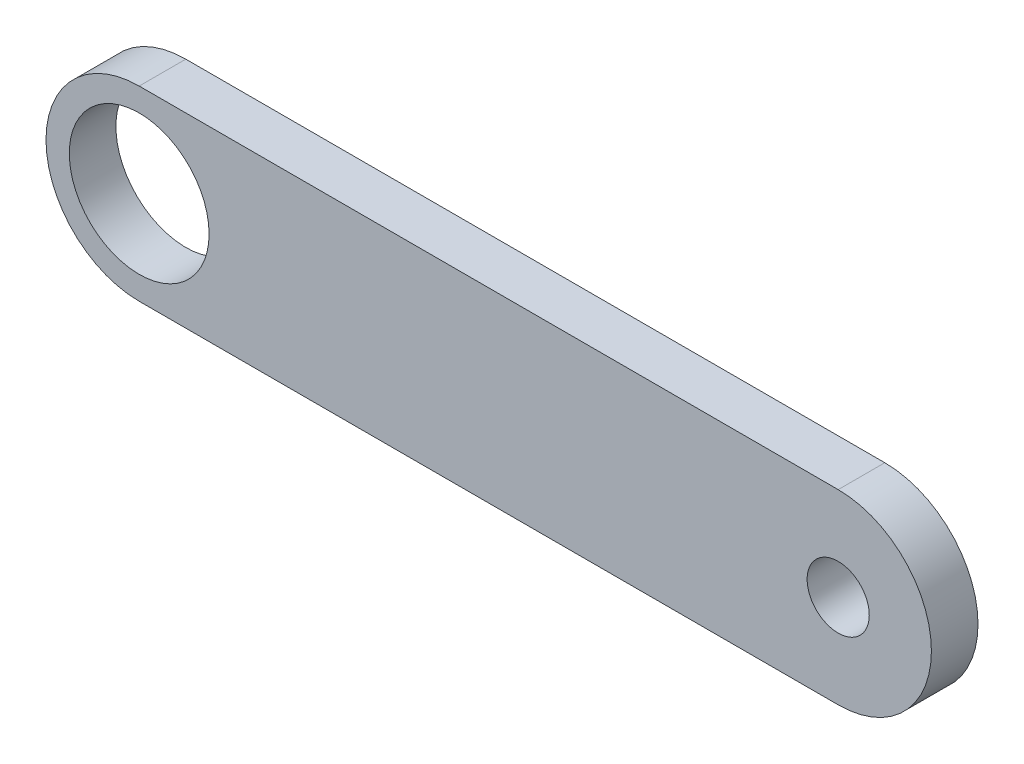
ISO-10303-21;
HEADER;
FILE_DESCRIPTION(('STEP AP214'),'2;1');
FILE_NAME('part.step','',(''),(''),'','','');
FILE_SCHEMA(('AUTOMOTIVE_DESIGN { 1 0 10303 214 1 1 1 1 }'));
ENDSEC;
DATA;
#1=APPLICATION_CONTEXT('core data for automotive mechanical design processes');
#2=APPLICATION_PROTOCOL_DEFINITION('international standard','automotive_design',2000,#1);
#3=PRODUCT_CONTEXT('',#1,'mechanical');
#4=PRODUCT('Part','Part','',(#3));
#5=PRODUCT_RELATED_PRODUCT_CATEGORY('part','',(#4));
#6=PRODUCT_DEFINITION_FORMATION('','',#4);
#7=PRODUCT_DEFINITION_CONTEXT('part definition',#1,'design');
#8=PRODUCT_DEFINITION('design','',#6,#7);
#9=PRODUCT_DEFINITION_SHAPE('','',#8);
#10=(LENGTH_UNIT() NAMED_UNIT(*) SI_UNIT(.MILLI.,.METRE.));
#11=(NAMED_UNIT(*) PLANE_ANGLE_UNIT() SI_UNIT($,.RADIAN.));
#12=(NAMED_UNIT(*) SI_UNIT($,.STERADIAN.) SOLID_ANGLE_UNIT());
#13=UNCERTAINTY_MEASURE_WITH_UNIT(LENGTH_MEASURE(1.E-05),#10,'distance_accuracy_value','');
#14=(GEOMETRIC_REPRESENTATION_CONTEXT(3) GLOBAL_UNCERTAINTY_ASSIGNED_CONTEXT((#13)) GLOBAL_UNIT_ASSIGNED_CONTEXT((#10,
#11,#12)) REPRESENTATION_CONTEXT('',''));
#15=CARTESIAN_POINT('',(0.,0.,0.));
#16=DIRECTION('',(0.,0.,1.));
#17=DIRECTION('',(1.,0.,0.));
#18=AXIS2_PLACEMENT_3D('',#15,#16,#17);
#19=CARTESIAN_POINT('',(0.,0.,3.));
#20=DIRECTION('',(0.,0.,1.));
#21=DIRECTION('',(1.,0.,0.));
#22=AXIS2_PLACEMENT_3D('',#19,#20,#21);
#23=PLANE('',#22);
#24=CARTESIAN_POINT('',(0.,0.,3.));
#25=DIRECTION('',(0.,0.,1.));
#26=DIRECTION('',(1.,0.,0.));
#27=AXIS2_PLACEMENT_3D('',#24,#25,#26);
#28=CIRCLE('',#27,4.5);
#29=CARTESIAN_POINT('',(4.5,0.,3.));
#30=VERTEX_POINT('',#29);
#31=EDGE_CURVE('E104',#30,#30,#28,.T.);
#32=ORIENTED_EDGE('',*,*,#31,.F.);
#33=EDGE_LOOP('',(#32));
#34=FACE_BOUND('',#33,.T.);
#35=CARTESIAN_POINT('',(0.,0.,3.));
#36=DIRECTION('',(0.,0.,1.));
#37=DIRECTION('',(1.,0.,0.));
#38=AXIS2_PLACEMENT_3D('',#35,#36,#37);
#39=CIRCLE('',#38,6.);
#40=CARTESIAN_POINT('',(0.,6.,3.));
#41=VERTEX_POINT('',#40);
#42=CARTESIAN_POINT('',(0.,-6.,3.));
#43=VERTEX_POINT('',#42);
#44=EDGE_CURVE('E89',#41,#43,#39,.T.);
#45=ORIENTED_EDGE('',*,*,#44,.T.);
#46=DIRECTION('',(1.,0.,0.));
#47=VECTOR('',#46,1.);
#48=CARTESIAN_POINT('',(0.,-6.,3.));
#49=LINE('',#48,#47);
#50=CARTESIAN_POINT('',(45.,-6.,3.));
#51=VERTEX_POINT('',#50);
#52=EDGE_CURVE('E84',#43,#51,#49,.T.);
#53=ORIENTED_EDGE('',*,*,#52,.T.);
#54=CARTESIAN_POINT('',(45.,0.,3.));
#55=DIRECTION('',(0.,0.,1.));
#56=DIRECTION('',(1.,0.,0.));
#57=AXIS2_PLACEMENT_3D('',#54,#55,#56);
#58=CIRCLE('',#57,6.);
#59=CARTESIAN_POINT('',(45.,6.,3.));
#60=VERTEX_POINT('',#59);
#61=EDGE_CURVE('E87',#51,#60,#58,.T.);
#62=ORIENTED_EDGE('',*,*,#61,.T.);
#63=DIRECTION('',(-1.,0.,0.));
#64=VECTOR('',#63,1.);
#65=CARTESIAN_POINT('',(0.,6.,3.));
#66=LINE('',#65,#64);
#67=EDGE_CURVE('E54',#60,#41,#66,.T.);
#68=ORIENTED_EDGE('',*,*,#67,.T.);
#69=EDGE_LOOP('',(#45,#53,#62,#68));
#70=FACE_BOUND('',#69,.T.);
#71=CARTESIAN_POINT('',(45.,0.,3.));
#72=DIRECTION('',(0.,0.,1.));
#73=DIRECTION('',(1.,0.,0.));
#74=AXIS2_PLACEMENT_3D('',#71,#72,#73);
#75=CIRCLE('',#74,2.);
#76=CARTESIAN_POINT('',(47.,0.,3.));
#77=VERTEX_POINT('',#76);
#78=EDGE_CURVE('E119',#77,#77,#75,.T.);
#79=ORIENTED_EDGE('',*,*,#78,.F.);
#80=EDGE_LOOP('',(#79));
#81=FACE_BOUND('',#80,.T.);
#82=ADVANCED_FACE('F37',(#34,#70,#81),#23,.T.);
#83=CARTESIAN_POINT('',(0.,0.,0.));
#84=DIRECTION('',(0.,0.,1.));
#85=DIRECTION('',(1.,0.,0.));
#86=AXIS2_PLACEMENT_3D('',#83,#84,#85);
#87=PLANE('',#86);
#88=CARTESIAN_POINT('',(0.,0.,0.));
#89=DIRECTION('',(0.,0.,1.));
#90=DIRECTION('',(1.,0.,0.));
#91=AXIS2_PLACEMENT_3D('',#88,#89,#90);
#92=CIRCLE('',#91,6.);
#93=CARTESIAN_POINT('',(0.,6.,0.));
#94=VERTEX_POINT('',#93);
#95=CARTESIAN_POINT('',(0.,-6.,0.));
#96=VERTEX_POINT('',#95);
#97=EDGE_CURVE('E101',#94,#96,#92,.T.);
#98=ORIENTED_EDGE('',*,*,#97,.F.);
#99=DIRECTION('',(-1.,0.,0.));
#100=VECTOR('',#99,1.);
#101=CARTESIAN_POINT('',(0.,6.,0.));
#102=LINE('',#101,#100);
#103=CARTESIAN_POINT('',(45.,6.,0.));
#104=VERTEX_POINT('',#103);
#105=EDGE_CURVE('E77',#104,#94,#102,.T.);
#106=ORIENTED_EDGE('',*,*,#105,.F.);
#107=CARTESIAN_POINT('',(45.,0.,0.));
#108=DIRECTION('',(0.,0.,1.));
#109=DIRECTION('',(1.,0.,0.));
#110=AXIS2_PLACEMENT_3D('',#107,#108,#109);
#111=CIRCLE('',#110,6.);
#112=CARTESIAN_POINT('',(45.,-6.,0.));
#113=VERTEX_POINT('',#112);
#114=EDGE_CURVE('E71',#113,#104,#111,.T.);
#115=ORIENTED_EDGE('',*,*,#114,.F.);
#116=DIRECTION('',(1.,0.,0.));
#117=VECTOR('',#116,1.);
#118=CARTESIAN_POINT('',(0.,-6.,0.));
#119=LINE('',#118,#117);
#120=EDGE_CURVE('E93',#96,#113,#119,.T.);
#121=ORIENTED_EDGE('',*,*,#120,.F.);
#122=EDGE_LOOP('',(#98,#106,#115,#121));
#123=FACE_BOUND('',#122,.T.);
#124=CARTESIAN_POINT('',(0.,0.,0.));
#125=DIRECTION('',(0.,0.,1.));
#126=DIRECTION('',(1.,0.,0.));
#127=AXIS2_PLACEMENT_3D('',#124,#125,#126);
#128=CIRCLE('',#127,4.5);
#129=CARTESIAN_POINT('',(4.5,0.,0.));
#130=VERTEX_POINT('',#129);
#131=EDGE_CURVE('E116',#130,#130,#128,.T.);
#132=ORIENTED_EDGE('',*,*,#131,.T.);
#133=EDGE_LOOP('',(#132));
#134=FACE_BOUND('',#133,.T.);
#135=CARTESIAN_POINT('',(45.,0.,0.));
#136=DIRECTION('',(0.,0.,1.));
#137=DIRECTION('',(1.,0.,0.));
#138=AXIS2_PLACEMENT_3D('',#135,#136,#137);
#139=CIRCLE('',#138,2.);
#140=CARTESIAN_POINT('',(47.,0.,0.));
#141=VERTEX_POINT('',#140);
#142=EDGE_CURVE('E122',#141,#141,#139,.T.);
#143=ORIENTED_EDGE('',*,*,#142,.T.);
#144=EDGE_LOOP('',(#143));
#145=FACE_BOUND('',#144,.T.);
#146=ADVANCED_FACE('F112',(#123,#134,#145),#87,.F.);
#147=CARTESIAN_POINT('',(0.,0.,3.));
#148=DIRECTION('',(0.,0.,-1.));
#149=DIRECTION('',(-1.,0.,0.));
#150=AXIS2_PLACEMENT_3D('',#147,#148,#149);
#151=CYLINDRICAL_SURFACE('',#150,6.);
#152=ORIENTED_EDGE('',*,*,#97,.T.);
#153=DIRECTION('',(0.,0.,-1.));
#154=VECTOR('',#153,1.);
#155=CARTESIAN_POINT('',(0.,-6.,3.));
#156=LINE('',#155,#154);
#157=EDGE_CURVE('E11',#43,#96,#156,.T.);
#158=ORIENTED_EDGE('',*,*,#157,.F.);
#159=ORIENTED_EDGE('',*,*,#44,.F.);
#160=DIRECTION('',(0.,0.,-1.));
#161=VECTOR('',#160,1.);
#162=CARTESIAN_POINT('',(0.,6.,3.));
#163=LINE('',#162,#161);
#164=EDGE_CURVE('E97',#41,#94,#163,.T.);
#165=ORIENTED_EDGE('',*,*,#164,.T.);
#166=EDGE_LOOP('',(#152,#158,#159,#165));
#167=FACE_BOUND('',#166,.T.);
#168=ADVANCED_FACE('F39',(#167),#151,.T.);
#169=CARTESIAN_POINT('',(0.,-6.,3.));
#170=DIRECTION('',(0.,1.,0.));
#171=DIRECTION('',(0.,0.,1.));
#172=AXIS2_PLACEMENT_3D('',#169,#170,#171);
#173=PLANE('',#172);
#174=ORIENTED_EDGE('',*,*,#120,.T.);
#175=DIRECTION('',(0.,0.,-1.));
#176=VECTOR('',#175,1.);
#177=CARTESIAN_POINT('',(45.,-6.,3.));
#178=LINE('',#177,#176);
#179=EDGE_CURVE('E46',#51,#113,#178,.T.);
#180=ORIENTED_EDGE('',*,*,#179,.F.);
#181=ORIENTED_EDGE('',*,*,#52,.F.);
#182=ORIENTED_EDGE('',*,*,#157,.T.);
#183=EDGE_LOOP('',(#174,#180,#181,#182));
#184=FACE_BOUND('',#183,.T.);
#185=ADVANCED_FACE('F92',(#184),#173,.F.);
#186=CARTESIAN_POINT('',(45.,0.,3.));
#187=DIRECTION('',(0.,0.,-1.));
#188=DIRECTION('',(-1.,0.,0.));
#189=AXIS2_PLACEMENT_3D('',#186,#187,#188);
#190=CYLINDRICAL_SURFACE('',#189,6.);
#191=ORIENTED_EDGE('',*,*,#114,.T.);
#192=DIRECTION('',(0.,0.,-1.));
#193=VECTOR('',#192,1.);
#194=CARTESIAN_POINT('',(45.,6.,3.));
#195=LINE('',#194,#193);
#196=EDGE_CURVE('E94',#60,#104,#195,.T.);
#197=ORIENTED_EDGE('',*,*,#196,.F.);
#198=ORIENTED_EDGE('',*,*,#61,.F.);
#199=ORIENTED_EDGE('',*,*,#179,.T.);
#200=EDGE_LOOP('',(#191,#197,#198,#199));
#201=FACE_BOUND('',#200,.T.);
#202=ADVANCED_FACE('F95',(#201),#190,.T.);
#203=CARTESIAN_POINT('',(0.,6.,3.));
#204=DIRECTION('',(0.,-1.,0.));
#205=DIRECTION('',(0.,0.,-1.));
#206=AXIS2_PLACEMENT_3D('',#203,#204,#205);
#207=PLANE('',#206);
#208=ORIENTED_EDGE('',*,*,#105,.T.);
#209=ORIENTED_EDGE('',*,*,#164,.F.);
#210=ORIENTED_EDGE('',*,*,#67,.F.);
#211=ORIENTED_EDGE('',*,*,#196,.T.);
#212=EDGE_LOOP('',(#208,#209,#210,#211));
#213=FACE_BOUND('',#212,.T.);
#214=ADVANCED_FACE('F109',(#213),#207,.F.);
#215=CARTESIAN_POINT('',(0.,0.,3.));
#216=DIRECTION('',(0.,0.,-1.));
#217=DIRECTION('',(-1.,0.,0.));
#218=AXIS2_PLACEMENT_3D('',#215,#216,#217);
#219=CYLINDRICAL_SURFACE('',#218,4.5);
#220=ORIENTED_EDGE('',*,*,#31,.T.);
#221=EDGE_LOOP('',(#220));
#222=FACE_BOUND('',#221,.T.);
#223=ORIENTED_EDGE('',*,*,#131,.F.);
#224=EDGE_LOOP('',(#223));
#225=FACE_BOUND('',#224,.T.);
#226=ADVANCED_FACE('F139',(#222,#225),#219,.F.);
#227=CARTESIAN_POINT('',(45.,0.,3.));
#228=DIRECTION('',(0.,0.,-1.));
#229=DIRECTION('',(-1.,0.,0.));
#230=AXIS2_PLACEMENT_3D('',#227,#228,#229);
#231=CYLINDRICAL_SURFACE('',#230,2.);
#232=ORIENTED_EDGE('',*,*,#78,.T.);
#233=EDGE_LOOP('',(#232));
#234=FACE_BOUND('',#233,.T.);
#235=ORIENTED_EDGE('',*,*,#142,.F.);
#236=EDGE_LOOP('',(#235));
#237=FACE_BOUND('',#236,.T.);
#238=ADVANCED_FACE('F128',(#234,#237),#231,.F.);
#239=CLOSED_SHELL('',(#82,#146,#168,#185,#202,#214,#226,#238));
#240=MANIFOLD_SOLID_BREP('B2',#239);
#241=ADVANCED_BREP_SHAPE_REPRESENTATION('',(#18,#240),#14);
#242=SHAPE_DEFINITION_REPRESENTATION(#9,#241);
ENDSEC;
END-ISO-10303-21;
